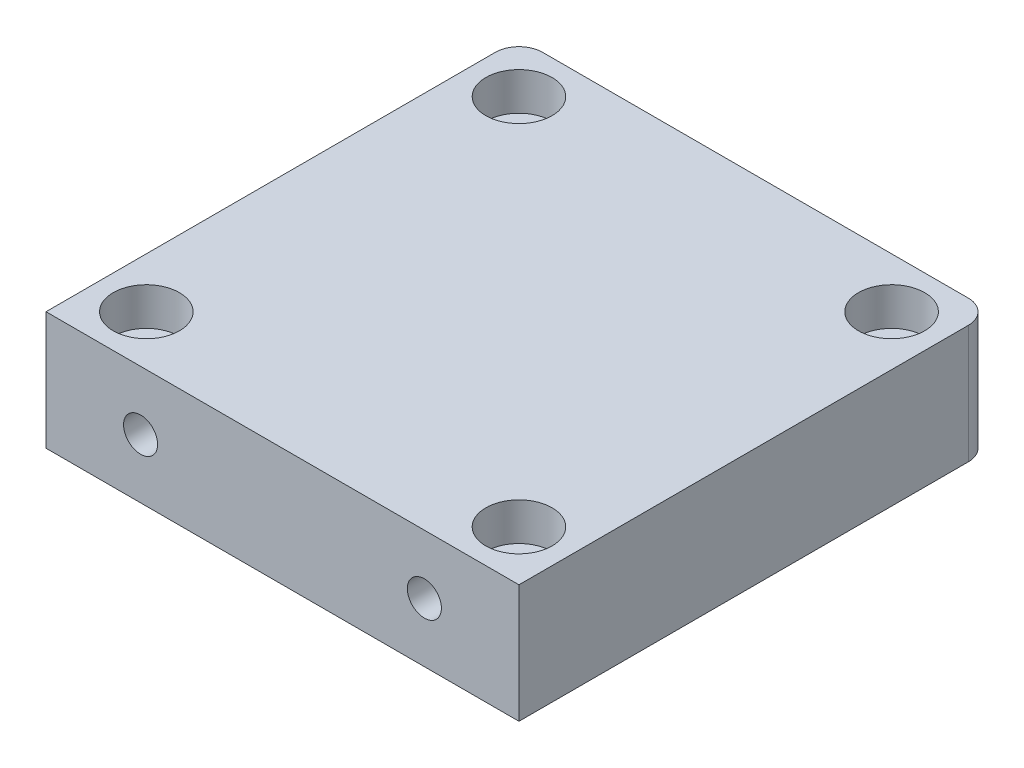
ISO-10303-21;
HEADER;
FILE_DESCRIPTION(('STEP AP214'),'2;1');
FILE_NAME('part.step','',(''),(''),'','','');
FILE_SCHEMA(('AUTOMOTIVE_DESIGN { 1 0 10303 214 1 1 1 1 }'));
ENDSEC;
DATA;
#1=APPLICATION_CONTEXT('core data for automotive mechanical design processes');
#2=APPLICATION_PROTOCOL_DEFINITION('international standard','automotive_design',2000,#1);
#3=PRODUCT_CONTEXT('',#1,'mechanical');
#4=PRODUCT('Part','Part','',(#3));
#5=PRODUCT_RELATED_PRODUCT_CATEGORY('part','',(#4));
#6=PRODUCT_DEFINITION_FORMATION('','',#4);
#7=PRODUCT_DEFINITION_CONTEXT('part definition',#1,'design');
#8=PRODUCT_DEFINITION('design','',#6,#7);
#9=PRODUCT_DEFINITION_SHAPE('','',#8);
#10=(LENGTH_UNIT() NAMED_UNIT(*) SI_UNIT(.MILLI.,.METRE.));
#11=(NAMED_UNIT(*) PLANE_ANGLE_UNIT() SI_UNIT($,.RADIAN.));
#12=(NAMED_UNIT(*) SI_UNIT($,.STERADIAN.) SOLID_ANGLE_UNIT());
#13=UNCERTAINTY_MEASURE_WITH_UNIT(LENGTH_MEASURE(1.E-05),#10,'distance_accuracy_value','');
#14=(GEOMETRIC_REPRESENTATION_CONTEXT(3) GLOBAL_UNCERTAINTY_ASSIGNED_CONTEXT((#13)) GLOBAL_UNIT_ASSIGNED_CONTEXT((#10,
#11,#12)) REPRESENTATION_CONTEXT('',''));
#15=CARTESIAN_POINT('',(0.,0.,0.));
#16=DIRECTION('',(0.,0.,1.));
#17=DIRECTION('',(1.,0.,0.));
#18=AXIS2_PLACEMENT_3D('',#15,#16,#17);
#19=CARTESIAN_POINT('',(89.3933982822018,25.,-10.6066017177982));
#20=DIRECTION('',(0.,-1.,0.));
#21=DIRECTION('',(0.,0.,-1.));
#22=AXIS2_PLACEMENT_3D('',#19,#20,#21);
#23=CYLINDRICAL_SURFACE('',#22,4.00000000000001);
#24=CARTESIAN_POINT('',(89.3933982822018,0.,-10.6066017177982));
#25=DIRECTION('',(0.,1.,0.));
#26=DIRECTION('',(0.,0.,1.));
#27=AXIS2_PLACEMENT_3D('',#24,#25,#26);
#28=CIRCLE('',#27,4.00000000000001);
#29=CARTESIAN_POINT('',(89.3933982822018,0.,-6.60660171779821));
#30=VERTEX_POINT('',#29);
#31=EDGE_CURVE('E140',#30,#30,#28,.T.);
#32=ORIENTED_EDGE('',*,*,#31,.F.);
#33=EDGE_LOOP('',(#32));
#34=FACE_BOUND('',#33,.T.);
#35=CARTESIAN_POINT('',(89.3933982822018,17.,-10.6066017177982));
#36=DIRECTION('',(0.,1.,0.));
#37=DIRECTION('',(0.,0.,1.));
#38=AXIS2_PLACEMENT_3D('',#35,#36,#37);
#39=CIRCLE('',#38,4.00000000000001);
#40=CARTESIAN_POINT('',(89.3933982822018,17.,-6.60660171779821));
#41=VERTEX_POINT('',#40);
#42=EDGE_CURVE('E51',#41,#41,#39,.T.);
#43=ORIENTED_EDGE('',*,*,#42,.T.);
#44=EDGE_LOOP('',(#43));
#45=FACE_BOUND('',#44,.T.);
#46=ADVANCED_FACE('F47',(#34,#45),#23,.F.);
#47=CARTESIAN_POINT('',(89.3933982822018,25.,-89.3933982822018));
#48=DIRECTION('',(0.,-1.,0.));
#49=DIRECTION('',(0.,0.,-1.));
#50=AXIS2_PLACEMENT_3D('',#47,#48,#49);
#51=CYLINDRICAL_SURFACE('',#50,4.00000000000001);
#52=CARTESIAN_POINT('',(89.3933982822018,0.,-89.3933982822018));
#53=DIRECTION('',(0.,1.,0.));
#54=DIRECTION('',(0.,0.,1.));
#55=AXIS2_PLACEMENT_3D('',#52,#53,#54);
#56=CIRCLE('',#55,4.00000000000001);
#57=CARTESIAN_POINT('',(89.3933982822018,0.,-85.3933982822018));
#58=VERTEX_POINT('',#57);
#59=EDGE_CURVE('E136',#58,#58,#56,.T.);
#60=ORIENTED_EDGE('',*,*,#59,.F.);
#61=EDGE_LOOP('',(#60));
#62=FACE_BOUND('',#61,.T.);
#63=CARTESIAN_POINT('',(89.3933982822018,17.,-89.3933982822018));
#64=DIRECTION('',(0.,1.,0.));
#65=DIRECTION('',(0.,0.,1.));
#66=AXIS2_PLACEMENT_3D('',#63,#64,#65);
#67=CIRCLE('',#66,4.00000000000001);
#68=CARTESIAN_POINT('',(89.3933982822018,17.,-85.3933982822018));
#69=VERTEX_POINT('',#68);
#70=EDGE_CURVE('E172',#69,#69,#67,.T.);
#71=ORIENTED_EDGE('',*,*,#70,.T.);
#72=EDGE_LOOP('',(#71));
#73=FACE_BOUND('',#72,.T.);
#74=ADVANCED_FACE('F216',(#62,#73),#51,.F.);
#75=CARTESIAN_POINT('',(10.6066017177982,25.,-89.3933982822018));
#76=DIRECTION('',(0.,-1.,0.));
#77=DIRECTION('',(0.,0.,-1.));
#78=AXIS2_PLACEMENT_3D('',#75,#76,#77);
#79=CYLINDRICAL_SURFACE('',#78,4.);
#80=CARTESIAN_POINT('',(10.6066017177982,0.,-89.3933982822018));
#81=DIRECTION('',(0.,1.,0.));
#82=DIRECTION('',(0.,0.,1.));
#83=AXIS2_PLACEMENT_3D('',#80,#81,#82);
#84=CIRCLE('',#83,4.);
#85=CARTESIAN_POINT('',(10.6066017177982,0.,-85.3933982822018));
#86=VERTEX_POINT('',#85);
#87=EDGE_CURVE('E133',#86,#86,#84,.T.);
#88=ORIENTED_EDGE('',*,*,#87,.F.);
#89=EDGE_LOOP('',(#88));
#90=FACE_BOUND('',#89,.T.);
#91=CARTESIAN_POINT('',(10.6066017177982,17.,-89.3933982822018));
#92=DIRECTION('',(0.,1.,0.));
#93=DIRECTION('',(0.,0.,1.));
#94=AXIS2_PLACEMENT_3D('',#91,#92,#93);
#95=CIRCLE('',#94,4.);
#96=CARTESIAN_POINT('',(10.6066017177982,17.,-85.3933982822018));
#97=VERTEX_POINT('',#96);
#98=EDGE_CURVE('E170',#97,#97,#95,.T.);
#99=ORIENTED_EDGE('',*,*,#98,.T.);
#100=EDGE_LOOP('',(#99));
#101=FACE_BOUND('',#100,.T.);
#102=ADVANCED_FACE('F222',(#90,#101),#79,.F.);
#103=CARTESIAN_POINT('',(10.6066017177982,25.,-10.6066017177982));
#104=DIRECTION('',(0.,-1.,0.));
#105=DIRECTION('',(0.,0.,-1.));
#106=AXIS2_PLACEMENT_3D('',#103,#104,#105);
#107=CYLINDRICAL_SURFACE('',#106,4.);
#108=CARTESIAN_POINT('',(10.6066017177982,0.,-10.6066017177982));
#109=DIRECTION('',(0.,1.,0.));
#110=DIRECTION('',(0.,0.,1.));
#111=AXIS2_PLACEMENT_3D('',#108,#109,#110);
#112=CIRCLE('',#111,4.);
#113=CARTESIAN_POINT('',(10.6066017177982,0.,-6.60660171779821));
#114=VERTEX_POINT('',#113);
#115=EDGE_CURVE('E143',#114,#114,#112,.T.);
#116=ORIENTED_EDGE('',*,*,#115,.F.);
#117=EDGE_LOOP('',(#116));
#118=FACE_BOUND('',#117,.T.);
#119=CARTESIAN_POINT('',(10.6066017177982,17.,-10.6066017177982));
#120=DIRECTION('',(0.,1.,0.));
#121=DIRECTION('',(0.,0.,1.));
#122=AXIS2_PLACEMENT_3D('',#119,#120,#121);
#123=CIRCLE('',#122,4.);
#124=CARTESIAN_POINT('',(10.6066017177982,17.,-6.60660171779821));
#125=VERTEX_POINT('',#124);
#126=EDGE_CURVE('E165',#125,#125,#123,.T.);
#127=ORIENTED_EDGE('',*,*,#126,.T.);
#128=EDGE_LOOP('',(#127));
#129=FACE_BOUND('',#128,.T.);
#130=ADVANCED_FACE('F227',(#118,#129),#107,.F.);
#131=CARTESIAN_POINT('',(0.,25.,-100.));
#132=DIRECTION('',(0.,0.,-1.));
#133=DIRECTION('',(-1.,0.,0.));
#134=AXIS2_PLACEMENT_3D('',#131,#132,#133);
#135=PLANE('',#134);
#136=DIRECTION('',(1.,0.,0.));
#137=VECTOR('',#136,1.);
#138=CARTESIAN_POINT('',(0.,25.,-100.));
#139=LINE('',#138,#137);
#140=CARTESIAN_POINT('',(5.,25.,-100.));
#141=VERTEX_POINT('',#140);
#142=CARTESIAN_POINT('',(95.,25.,-100.));
#143=VERTEX_POINT('',#142);
#144=EDGE_CURVE('E125',#141,#143,#139,.T.);
#145=ORIENTED_EDGE('',*,*,#144,.T.);
#146=DIRECTION('',(0.,-1.,0.));
#147=VECTOR('',#146,1.);
#148=CARTESIAN_POINT('',(95.,0.,-100.));
#149=LINE('',#148,#147);
#150=CARTESIAN_POINT('',(95.,0.,-100.));
#151=VERTEX_POINT('',#150);
#152=EDGE_CURVE('E155',#143,#151,#149,.T.);
#153=ORIENTED_EDGE('',*,*,#152,.T.);
#154=DIRECTION('',(1.,0.,0.));
#155=VECTOR('',#154,1.);
#156=CARTESIAN_POINT('',(0.,0.,-100.));
#157=LINE('',#156,#155);
#158=CARTESIAN_POINT('',(5.,0.,-100.));
#159=VERTEX_POINT('',#158);
#160=EDGE_CURVE('E146',#159,#151,#157,.T.);
#161=ORIENTED_EDGE('',*,*,#160,.F.);
#162=DIRECTION('',(0.,-1.,0.));
#163=VECTOR('',#162,1.);
#164=CARTESIAN_POINT('',(5.,25.,-100.));
#165=LINE('',#164,#163);
#166=EDGE_CURVE('E114',#159,#141,#165,.F.);
#167=ORIENTED_EDGE('',*,*,#166,.T.);
#168=EDGE_LOOP('',(#145,#153,#161,#167));
#169=FACE_BOUND('',#168,.T.);
#170=ADVANCED_FACE('F212',(#169),#135,.T.);
#171=CARTESIAN_POINT('',(0.,25.,0.));
#172=DIRECTION('',(-1.,0.,0.));
#173=DIRECTION('',(0.,0.,1.));
#174=AXIS2_PLACEMENT_3D('',#171,#172,#173);
#175=PLANE('',#174);
#176=DIRECTION('',(0.,0.,-1.));
#177=VECTOR('',#176,1.);
#178=CARTESIAN_POINT('',(0.,25.,0.));
#179=LINE('',#178,#177);
#180=CARTESIAN_POINT('',(0.,25.,0.));
#181=VERTEX_POINT('',#180);
#182=CARTESIAN_POINT('',(0.,25.,-95.));
#183=VERTEX_POINT('',#182);
#184=EDGE_CURVE('E107',#181,#183,#179,.T.);
#185=ORIENTED_EDGE('',*,*,#184,.T.);
#186=DIRECTION('',(0.,-1.,0.));
#187=VECTOR('',#186,1.);
#188=CARTESIAN_POINT('',(0.,25.,-95.));
#189=LINE('',#188,#187);
#190=CARTESIAN_POINT('',(0.,0.,-95.));
#191=VERTEX_POINT('',#190);
#192=EDGE_CURVE('E13',#183,#191,#189,.T.);
#193=ORIENTED_EDGE('',*,*,#192,.T.);
#194=DIRECTION('',(0.,0.,-1.));
#195=VECTOR('',#194,1.);
#196=CARTESIAN_POINT('',(0.,0.,0.));
#197=LINE('',#196,#195);
#198=CARTESIAN_POINT('',(0.,0.,0.));
#199=VERTEX_POINT('',#198);
#200=EDGE_CURVE('E110',#199,#191,#197,.T.);
#201=ORIENTED_EDGE('',*,*,#200,.F.);
#202=DIRECTION('',(0.,-1.,0.));
#203=VECTOR('',#202,1.);
#204=CARTESIAN_POINT('',(0.,25.,0.));
#205=LINE('',#204,#203);
#206=EDGE_CURVE('E104',#181,#199,#205,.T.);
#207=ORIENTED_EDGE('',*,*,#206,.F.);
#208=EDGE_LOOP('',(#185,#193,#201,#207));
#209=FACE_BOUND('',#208,.T.);
#210=ADVANCED_FACE('F106',(#209),#175,.T.);
#211=CARTESIAN_POINT('',(0.,25.,0.));
#212=DIRECTION('',(0.,0.,-1.));
#213=DIRECTION('',(-1.,0.,0.));
#214=AXIS2_PLACEMENT_3D('',#211,#212,#213);
#215=PLANE('',#214);
#216=CARTESIAN_POINT('',(80.,12.5,0.));
#217=DIRECTION('',(0.,0.,1.));
#218=DIRECTION('',(1.,0.,0.));
#219=AXIS2_PLACEMENT_3D('',#216,#217,#218);
#220=CIRCLE('',#219,3.6);
#221=CARTESIAN_POINT('',(83.6,12.5,0.));
#222=VERTEX_POINT('',#221);
#223=EDGE_CURVE('E191',#222,#222,#220,.T.);
#224=ORIENTED_EDGE('',*,*,#223,.F.);
#225=EDGE_LOOP('',(#224));
#226=FACE_BOUND('',#225,.T.);
#227=CARTESIAN_POINT('',(20.,12.5,0.));
#228=DIRECTION('',(0.,0.,1.));
#229=DIRECTION('',(1.,0.,0.));
#230=AXIS2_PLACEMENT_3D('',#227,#228,#229);
#231=CIRCLE('',#230,3.6);
#232=CARTESIAN_POINT('',(23.6,12.5,0.));
#233=VERTEX_POINT('',#232);
#234=EDGE_CURVE('E194',#233,#233,#231,.T.);
#235=ORIENTED_EDGE('',*,*,#234,.F.);
#236=EDGE_LOOP('',(#235));
#237=FACE_BOUND('',#236,.T.);
#238=DIRECTION('',(1.,0.,0.));
#239=VECTOR('',#238,1.);
#240=CARTESIAN_POINT('',(0.,0.,0.));
#241=LINE('',#240,#239);
#242=CARTESIAN_POINT('',(100.,0.,0.));
#243=VERTEX_POINT('',#242);
#244=EDGE_CURVE('E150',#199,#243,#241,.T.);
#245=ORIENTED_EDGE('',*,*,#244,.T.);
#246=DIRECTION('',(0.,-1.,0.));
#247=VECTOR('',#246,1.);
#248=CARTESIAN_POINT('',(100.,25.,0.));
#249=LINE('',#248,#247);
#250=CARTESIAN_POINT('',(100.,25.,0.));
#251=VERTEX_POINT('',#250);
#252=EDGE_CURVE('E115',#251,#243,#249,.T.);
#253=ORIENTED_EDGE('',*,*,#252,.F.);
#254=DIRECTION('',(1.,0.,0.));
#255=VECTOR('',#254,1.);
#256=CARTESIAN_POINT('',(0.,25.,0.));
#257=LINE('',#256,#255);
#258=EDGE_CURVE('E119',#181,#251,#257,.T.);
#259=ORIENTED_EDGE('',*,*,#258,.F.);
#260=ORIENTED_EDGE('',*,*,#206,.T.);
#261=EDGE_LOOP('',(#245,#253,#259,#260));
#262=FACE_BOUND('',#261,.T.);
#263=ADVANCED_FACE('F120',(#226,#237,#262),#215,.F.);
#264=CARTESIAN_POINT('',(100.,25.,0.));
#265=DIRECTION('',(-1.,0.,0.));
#266=DIRECTION('',(0.,0.,1.));
#267=AXIS2_PLACEMENT_3D('',#264,#265,#266);
#268=PLANE('',#267);
#269=DIRECTION('',(0.,0.,-1.));
#270=VECTOR('',#269,1.);
#271=CARTESIAN_POINT('',(100.,0.,0.));
#272=LINE('',#271,#270);
#273=CARTESIAN_POINT('',(100.,0.,-95.));
#274=VERTEX_POINT('',#273);
#275=EDGE_CURVE('E128',#243,#274,#272,.T.);
#276=ORIENTED_EDGE('',*,*,#275,.T.);
#277=DIRECTION('',(0.,-1.,0.));
#278=VECTOR('',#277,1.);
#279=CARTESIAN_POINT('',(100.,25.,-95.));
#280=LINE('',#279,#278);
#281=CARTESIAN_POINT('',(100.,25.,-95.));
#282=VERTEX_POINT('',#281);
#283=EDGE_CURVE('E72',#274,#282,#280,.F.);
#284=ORIENTED_EDGE('',*,*,#283,.T.);
#285=DIRECTION('',(0.,0.,-1.));
#286=VECTOR('',#285,1.);
#287=CARTESIAN_POINT('',(100.,25.,0.));
#288=LINE('',#287,#286);
#289=EDGE_CURVE('E122',#251,#282,#288,.T.);
#290=ORIENTED_EDGE('',*,*,#289,.F.);
#291=ORIENTED_EDGE('',*,*,#252,.T.);
#292=EDGE_LOOP('',(#276,#284,#290,#291));
#293=FACE_BOUND('',#292,.T.);
#294=ADVANCED_FACE('F204',(#293),#268,.F.);
#295=CARTESIAN_POINT('',(0.,25.,0.));
#296=DIRECTION('',(0.,1.,0.));
#297=DIRECTION('',(0.,0.,1.));
#298=AXIS2_PLACEMENT_3D('',#295,#296,#297);
#299=PLANE('',#298);
#300=CARTESIAN_POINT('',(10.6066017177982,25.,-89.3933982822018));
#301=DIRECTION('',(0.,1.,0.));
#302=DIRECTION('',(0.,0.,1.));
#303=AXIS2_PLACEMENT_3D('',#300,#301,#302);
#304=CIRCLE('',#303,7.);
#305=CARTESIAN_POINT('',(10.6066017177982,25.,-96.3933982822018));
#306=VERTEX_POINT('',#305);
#307=EDGE_CURVE('E309',#306,#306,#304,.T.);
#308=ORIENTED_EDGE('',*,*,#307,.F.);
#309=EDGE_LOOP('',(#308));
#310=FACE_BOUND('',#309,.T.);
#311=CARTESIAN_POINT('',(89.3933982822018,25.,-89.3933982822018));
#312=DIRECTION('',(0.,1.,0.));
#313=DIRECTION('',(0.,0.,1.));
#314=AXIS2_PLACEMENT_3D('',#311,#312,#313);
#315=CIRCLE('',#314,7.);
#316=CARTESIAN_POINT('',(89.3933982822018,25.,-96.3933982822018));
#317=VERTEX_POINT('',#316);
#318=EDGE_CURVE('E314',#317,#317,#315,.T.);
#319=ORIENTED_EDGE('',*,*,#318,.F.);
#320=EDGE_LOOP('',(#319));
#321=FACE_BOUND('',#320,.T.);
#322=CARTESIAN_POINT('',(89.3933982822018,25.,-10.6066017177982));
#323=DIRECTION('',(0.,1.,0.));
#324=DIRECTION('',(0.,0.,1.));
#325=AXIS2_PLACEMENT_3D('',#322,#323,#324);
#326=CIRCLE('',#325,7.);
#327=CARTESIAN_POINT('',(89.3933982822018,25.,-17.6066017177982));
#328=VERTEX_POINT('',#327);
#329=EDGE_CURVE('E318',#328,#328,#326,.T.);
#330=ORIENTED_EDGE('',*,*,#329,.F.);
#331=EDGE_LOOP('',(#330));
#332=FACE_BOUND('',#331,.T.);
#333=CARTESIAN_POINT('',(10.6066017177982,25.,-10.6066017177982));
#334=DIRECTION('',(0.,1.,0.));
#335=DIRECTION('',(0.,0.,1.));
#336=AXIS2_PLACEMENT_3D('',#333,#334,#335);
#337=CIRCLE('',#336,7.);
#338=CARTESIAN_POINT('',(10.6066017177982,25.,-17.6066017177982));
#339=VERTEX_POINT('',#338);
#340=EDGE_CURVE('E169',#339,#339,#337,.T.);
#341=ORIENTED_EDGE('',*,*,#340,.F.);
#342=EDGE_LOOP('',(#341));
#343=FACE_BOUND('',#342,.T.);
#344=ORIENTED_EDGE('',*,*,#289,.T.);
#345=CARTESIAN_POINT('',(95.,25.,-95.));
#346=DIRECTION('',(0.,1.,0.));
#347=DIRECTION('',(0.,0.,1.));
#348=AXIS2_PLACEMENT_3D('',#345,#346,#347);
#349=CIRCLE('',#348,5.);
#350=EDGE_CURVE('E56',#282,#143,#349,.T.);
#351=ORIENTED_EDGE('',*,*,#350,.T.);
#352=ORIENTED_EDGE('',*,*,#144,.F.);
#353=CARTESIAN_POINT('',(5.,25.,-95.));
#354=DIRECTION('',(0.,1.,0.));
#355=DIRECTION('',(0.,0.,1.));
#356=AXIS2_PLACEMENT_3D('',#353,#354,#355);
#357=CIRCLE('',#356,5.);
#358=EDGE_CURVE('E64',#141,#183,#357,.T.);
#359=ORIENTED_EDGE('',*,*,#358,.T.);
#360=ORIENTED_EDGE('',*,*,#184,.F.);
#361=ORIENTED_EDGE('',*,*,#258,.T.);
#362=EDGE_LOOP('',(#344,#351,#352,#359,#360,#361));
#363=FACE_BOUND('',#362,.T.);
#364=ADVANCED_FACE('F124',(#310,#321,#332,#343,#363),#299,.T.);
#365=CARTESIAN_POINT('',(0.,0.,0.));
#366=DIRECTION('',(0.,1.,0.));
#367=DIRECTION('',(0.,0.,1.));
#368=AXIS2_PLACEMENT_3D('',#365,#366,#367);
#369=PLANE('',#368);
#370=ORIENTED_EDGE('',*,*,#87,.T.);
#371=EDGE_LOOP('',(#370));
#372=FACE_BOUND('',#371,.T.);
#373=ORIENTED_EDGE('',*,*,#59,.T.);
#374=EDGE_LOOP('',(#373));
#375=FACE_BOUND('',#374,.T.);
#376=ORIENTED_EDGE('',*,*,#31,.T.);
#377=EDGE_LOOP('',(#376));
#378=FACE_BOUND('',#377,.T.);
#379=ORIENTED_EDGE('',*,*,#115,.T.);
#380=EDGE_LOOP('',(#379));
#381=FACE_BOUND('',#380,.T.);
#382=ORIENTED_EDGE('',*,*,#160,.T.);
#383=CARTESIAN_POINT('',(95.,0.,-95.));
#384=DIRECTION('',(0.,1.,0.));
#385=DIRECTION('',(0.,0.,1.));
#386=AXIS2_PLACEMENT_3D('',#383,#384,#385);
#387=CIRCLE('',#386,5.);
#388=EDGE_CURVE('E160',#151,#274,#387,.F.);
#389=ORIENTED_EDGE('',*,*,#388,.T.);
#390=ORIENTED_EDGE('',*,*,#275,.F.);
#391=ORIENTED_EDGE('',*,*,#244,.F.);
#392=ORIENTED_EDGE('',*,*,#200,.T.);
#393=CARTESIAN_POINT('',(5.,0.,-95.));
#394=DIRECTION('',(0.,1.,0.));
#395=DIRECTION('',(0.,0.,1.));
#396=AXIS2_PLACEMENT_3D('',#393,#394,#395);
#397=CIRCLE('',#396,5.);
#398=EDGE_CURVE('E158',#191,#159,#397,.F.);
#399=ORIENTED_EDGE('',*,*,#398,.T.);
#400=EDGE_LOOP('',(#382,#389,#390,#391,#392,#399));
#401=FACE_BOUND('',#400,.T.);
#402=ADVANCED_FACE('F251',(#372,#375,#378,#381,#401),#369,.F.);
#403=CARTESIAN_POINT('',(20.,12.5,-20.));
#404=DIRECTION('',(0.,0.,1.));
#405=DIRECTION('',(1.,0.,0.));
#406=AXIS2_PLACEMENT_3D('',#403,#404,#405);
#407=CYLINDRICAL_SURFACE('',#406,3.6);
#408=CARTESIAN_POINT('',(20.,12.5,-20.));
#409=DIRECTION('',(0.,0.,1.));
#410=DIRECTION('',(1.,0.,0.));
#411=AXIS2_PLACEMENT_3D('',#408,#409,#410);
#412=CIRCLE('',#411,3.6);
#413=CARTESIAN_POINT('',(23.6,12.5,-20.));
#414=VERTEX_POINT('',#413);
#415=EDGE_CURVE('E137',#414,#414,#412,.T.);
#416=ORIENTED_EDGE('',*,*,#415,.F.);
#417=EDGE_LOOP('',(#416));
#418=FACE_BOUND('',#417,.T.);
#419=ORIENTED_EDGE('',*,*,#234,.T.);
#420=EDGE_LOOP('',(#419));
#421=FACE_BOUND('',#420,.T.);
#422=ADVANCED_FACE('F201',(#418,#421),#407,.F.);
#423=CARTESIAN_POINT('',(20.,12.5,-20.));
#424=DIRECTION('',(0.,0.,1.));
#425=DIRECTION('',(1.,0.,0.));
#426=AXIS2_PLACEMENT_3D('',#423,#424,#425);
#427=PLANE('',#426);
#428=ORIENTED_EDGE('',*,*,#415,.T.);
#429=EDGE_LOOP('',(#428));
#430=FACE_BOUND('',#429,.T.);
#431=ADVANCED_FACE('F259',(#430),#427,.T.);
#432=CARTESIAN_POINT('',(80.,12.5,-20.));
#433=DIRECTION('',(0.,0.,1.));
#434=DIRECTION('',(1.,0.,0.));
#435=AXIS2_PLACEMENT_3D('',#432,#433,#434);
#436=CYLINDRICAL_SURFACE('',#435,3.6);
#437=CARTESIAN_POINT('',(80.,12.5,-20.));
#438=DIRECTION('',(0.,0.,1.));
#439=DIRECTION('',(1.,0.,0.));
#440=AXIS2_PLACEMENT_3D('',#437,#438,#439);
#441=CIRCLE('',#440,3.6);
#442=CARTESIAN_POINT('',(83.6,12.5,-20.));
#443=VERTEX_POINT('',#442);
#444=EDGE_CURVE('E168',#443,#443,#441,.T.);
#445=ORIENTED_EDGE('',*,*,#444,.F.);
#446=EDGE_LOOP('',(#445));
#447=FACE_BOUND('',#446,.T.);
#448=ORIENTED_EDGE('',*,*,#223,.T.);
#449=EDGE_LOOP('',(#448));
#450=FACE_BOUND('',#449,.T.);
#451=ADVANCED_FACE('F242',(#447,#450),#436,.F.);
#452=CARTESIAN_POINT('',(80.,12.5,-20.));
#453=DIRECTION('',(0.,0.,1.));
#454=DIRECTION('',(1.,0.,0.));
#455=AXIS2_PLACEMENT_3D('',#452,#453,#454);
#456=PLANE('',#455);
#457=ORIENTED_EDGE('',*,*,#444,.T.);
#458=EDGE_LOOP('',(#457));
#459=FACE_BOUND('',#458,.T.);
#460=ADVANCED_FACE('F234',(#459),#456,.T.);
#461=CARTESIAN_POINT('',(95.,25.,-95.));
#462=DIRECTION('',(0.,1.,0.));
#463=DIRECTION('',(0.,0.,1.));
#464=AXIS2_PLACEMENT_3D('',#461,#462,#463);
#465=CYLINDRICAL_SURFACE('',#464,5.);
#466=ORIENTED_EDGE('',*,*,#350,.F.);
#467=ORIENTED_EDGE('',*,*,#283,.F.);
#468=ORIENTED_EDGE('',*,*,#388,.F.);
#469=ORIENTED_EDGE('',*,*,#152,.F.);
#470=EDGE_LOOP('',(#466,#467,#468,#469));
#471=FACE_BOUND('',#470,.T.);
#472=ADVANCED_FACE('F232',(#471),#465,.T.);
#473=CARTESIAN_POINT('',(5.,25.,-95.));
#474=DIRECTION('',(0.,-1.,0.));
#475=DIRECTION('',(0.,0.,-1.));
#476=AXIS2_PLACEMENT_3D('',#473,#474,#475);
#477=CYLINDRICAL_SURFACE('',#476,5.);
#478=ORIENTED_EDGE('',*,*,#358,.F.);
#479=ORIENTED_EDGE('',*,*,#166,.F.);
#480=ORIENTED_EDGE('',*,*,#398,.F.);
#481=ORIENTED_EDGE('',*,*,#192,.F.);
#482=EDGE_LOOP('',(#478,#479,#480,#481));
#483=FACE_BOUND('',#482,.T.);
#484=ADVANCED_FACE('F49',(#483),#477,.T.);
#485=CARTESIAN_POINT('',(10.6066017177982,44.7989898732233,-10.6066017177982));
#486=DIRECTION('',(0.,-1.,0.));
#487=DIRECTION('',(0.,0.,-1.));
#488=AXIS2_PLACEMENT_3D('',#485,#486,#487);
#489=CYLINDRICAL_SURFACE('',#488,7.);
#490=CARTESIAN_POINT('',(10.6066017177982,17.,-10.6066017177982));
#491=DIRECTION('',(0.,1.,0.));
#492=DIRECTION('',(0.,0.,1.));
#493=AXIS2_PLACEMENT_3D('',#490,#491,#492);
#494=CIRCLE('',#493,7.);
#495=CARTESIAN_POINT('',(10.6066017177982,17.,-17.6066017177982));
#496=VERTEX_POINT('',#495);
#497=EDGE_CURVE('E178',#496,#496,#494,.T.);
#498=CARTESIAN_POINT('',(10.6066017177982,17.,-17.6066017177982));
#499=CARTESIAN_POINT('',(10.6066017177982,17.0833333333333,-17.6066017177982));
#500=CARTESIAN_POINT('',(10.6066017177982,17.1666666666667,-17.6066017177982));
#501=CARTESIAN_POINT('',(10.6066017177982,17.3333333333333,-17.6066017177982));
#502=CARTESIAN_POINT('',(10.6066017177982,17.4166666666667,-17.6066017177982));
#503=CARTESIAN_POINT('',(10.6066017177982,17.5833333333333,-17.6066017177982));
#504=CARTESIAN_POINT('',(10.6066017177982,17.6666666666667,-17.6066017177982));
#505=CARTESIAN_POINT('',(10.6066017177982,17.8333333333333,-17.6066017177982));
#506=CARTESIAN_POINT('',(10.6066017177982,17.9166666666667,-17.6066017177982));
#507=CARTESIAN_POINT('',(10.6066017177982,18.0833333333333,-17.6066017177982));
#508=CARTESIAN_POINT('',(10.6066017177982,18.1666666666667,-17.6066017177982));
#509=CARTESIAN_POINT('',(10.6066017177982,18.3333333333333,-17.6066017177982));
#510=CARTESIAN_POINT('',(10.6066017177982,18.4166666666667,-17.6066017177982));
#511=CARTESIAN_POINT('',(10.6066017177982,18.5833333333333,-17.6066017177982));
#512=CARTESIAN_POINT('',(10.6066017177982,18.6666666666667,-17.6066017177982));
#513=CARTESIAN_POINT('',(10.6066017177982,18.8333333333333,-17.6066017177982));
#514=CARTESIAN_POINT('',(10.6066017177982,18.9166666666667,-17.6066017177982));
#515=CARTESIAN_POINT('',(10.6066017177982,19.0833333333333,-17.6066017177982));
#516=CARTESIAN_POINT('',(10.6066017177982,19.1666666666667,-17.6066017177982));
#517=CARTESIAN_POINT('',(10.6066017177982,19.3333333333333,-17.6066017177982));
#518=CARTESIAN_POINT('',(10.6066017177982,19.4166666666667,-17.6066017177982));
#519=CARTESIAN_POINT('',(10.6066017177982,19.5833333333333,-17.6066017177982));
#520=CARTESIAN_POINT('',(10.6066017177982,19.6666666666667,-17.6066017177982));
#521=CARTESIAN_POINT('',(10.6066017177982,19.8333333333333,-17.6066017177982));
#522=CARTESIAN_POINT('',(10.6066017177982,19.9166666666667,-17.6066017177982));
#523=CARTESIAN_POINT('',(10.6066017177982,20.0833333333333,-17.6066017177982));
#524=CARTESIAN_POINT('',(10.6066017177982,20.1666666666667,-17.6066017177982));
#525=CARTESIAN_POINT('',(10.6066017177982,20.3333333333333,-17.6066017177982));
#526=CARTESIAN_POINT('',(10.6066017177982,20.4166666666667,-17.6066017177982));
#527=CARTESIAN_POINT('',(10.6066017177982,20.5833333333333,-17.6066017177982));
#528=CARTESIAN_POINT('',(10.6066017177982,20.6666666666667,-17.6066017177982));
#529=CARTESIAN_POINT('',(10.6066017177982,20.8333333333333,-17.6066017177982));
#530=CARTESIAN_POINT('',(10.6066017177982,20.9166666666667,-17.6066017177982));
#531=CARTESIAN_POINT('',(10.6066017177982,21.0833333333333,-17.6066017177982));
#532=CARTESIAN_POINT('',(10.6066017177982,21.1666666666667,-17.6066017177982));
#533=CARTESIAN_POINT('',(10.6066017177982,21.3333333333333,-17.6066017177982));
#534=CARTESIAN_POINT('',(10.6066017177982,21.4166666666667,-17.6066017177982));
#535=CARTESIAN_POINT('',(10.6066017177982,21.5833333333333,-17.6066017177982));
#536=CARTESIAN_POINT('',(10.6066017177982,21.6666666666667,-17.6066017177982));
#537=CARTESIAN_POINT('',(10.6066017177982,21.8333333333333,-17.6066017177982));
#538=CARTESIAN_POINT('',(10.6066017177982,21.9166666666667,-17.6066017177982));
#539=CARTESIAN_POINT('',(10.6066017177982,22.0833333333333,-17.6066017177982));
#540=CARTESIAN_POINT('',(10.6066017177982,22.1666666666667,-17.6066017177982));
#541=CARTESIAN_POINT('',(10.6066017177982,22.3333333333333,-17.6066017177982));
#542=CARTESIAN_POINT('',(10.6066017177982,22.4166666666667,-17.6066017177982));
#543=CARTESIAN_POINT('',(10.6066017177982,22.5833333333333,-17.6066017177982));
#544=CARTESIAN_POINT('',(10.6066017177982,22.6666666666667,-17.6066017177982));
#545=CARTESIAN_POINT('',(10.6066017177982,22.8333333333333,-17.6066017177982));
#546=CARTESIAN_POINT('',(10.6066017177982,22.9166666666667,-17.6066017177982));
#547=CARTESIAN_POINT('',(10.6066017177982,23.0833333333333,-17.6066017177982));
#548=CARTESIAN_POINT('',(10.6066017177982,23.1666666666667,-17.6066017177982));
#549=CARTESIAN_POINT('',(10.6066017177982,23.3333333333333,-17.6066017177982));
#550=CARTESIAN_POINT('',(10.6066017177982,23.4166666666667,-17.6066017177982));
#551=CARTESIAN_POINT('',(10.6066017177982,23.5833333333333,-17.6066017177982));
#552=CARTESIAN_POINT('',(10.6066017177982,23.6666666666667,-17.6066017177982));
#553=CARTESIAN_POINT('',(10.6066017177982,23.8333333333333,-17.6066017177982));
#554=CARTESIAN_POINT('',(10.6066017177982,23.9166666666667,-17.6066017177982));
#555=CARTESIAN_POINT('',(10.6066017177982,24.0833333333333,-17.6066017177982));
#556=CARTESIAN_POINT('',(10.6066017177982,24.1666666666667,-17.6066017177982));
#557=CARTESIAN_POINT('',(10.6066017177982,24.3333333333333,-17.6066017177982));
#558=CARTESIAN_POINT('',(10.6066017177982,24.4166666666667,-17.6066017177982));
#559=CARTESIAN_POINT('',(10.6066017177982,24.5833333333333,-17.6066017177982));
#560=CARTESIAN_POINT('',(10.6066017177982,24.6666666666667,-17.6066017177982));
#561=CARTESIAN_POINT('',(10.6066017177982,24.8333333333333,-17.6066017177982));
#562=CARTESIAN_POINT('',(10.6066017177982,24.9166666666667,-17.6066017177982));
#563=CARTESIAN_POINT('',(10.6066017177982,25.,-17.6066017177982));
#564=B_SPLINE_CURVE_WITH_KNOTS('',3,(#498,#499,#500,#501,#502,#503,#504,#505,#506,#507,#508,
#509,#510,#511,#512,#513,#514,#515,#516,#517,#518,#519,#520,#521,#522,#523,#524,#525,#526,#527,
#528,#529,#530,#531,#532,#533,#534,#535,#536,#537,#538,#539,#540,#541,#542,#543,#544,#545,#546,
#547,#548,#549,#550,#551,#552,#553,#554,#555,#556,#557,#558,#559,#560,#561,#562,#563),
.UNSPECIFIED.,.F.,.F.,(4,2,2,2,2,2,2,2,2,2,2,2,2,2,2,2,2,2,2,2,2,2,2,2,2,2,2,2,2,2,2,2,4),(0.,
0.25,0.5,0.750000000000001,1.,1.25,1.5,1.75,2.,2.25,2.5,2.75,3.,3.25,3.5,3.75,4.,4.25,4.5,4.75,
5.,5.25,5.5,5.75,6.,6.25,6.5,6.75,7.,7.25,7.5,7.75,8.),.UNSPECIFIED.);
#565=EDGE_CURVE('BSEAM240',#496,#339,#564,.T.);
#566=ORIENTED_EDGE('',*,*,#497,.F.);
#567=ORIENTED_EDGE('',*,*,#340,.T.);
#568=ORIENTED_EDGE('',*,*,#565,.T.);
#569=ORIENTED_EDGE('',*,*,#565,.F.);
#570=EDGE_LOOP('',(#566,#568,#567,#569));
#571=FACE_BOUND('',#570,.T.);
#572=ADVANCED_FACE('F240',(#571),#489,.F.);
#573=CARTESIAN_POINT('',(10.6066017177982,17.,-10.6066017177982));
#574=DIRECTION('',(0.,1.,0.));
#575=DIRECTION('',(0.,0.,1.));
#576=AXIS2_PLACEMENT_3D('',#573,#574,#575);
#577=PLANE('',#576);
#578=ORIENTED_EDGE('',*,*,#126,.F.);
#579=EDGE_LOOP('',(#578));
#580=FACE_BOUND('',#579,.T.);
#581=ORIENTED_EDGE('',*,*,#497,.T.);
#582=EDGE_LOOP('',(#581));
#583=FACE_BOUND('',#582,.T.);
#584=ADVANCED_FACE('F274',(#580,#583),#577,.T.);
#585=CARTESIAN_POINT('',(89.3933982822018,44.7989898732233,-10.6066017177982));
#586=DIRECTION('',(0.,-1.,0.));
#587=DIRECTION('',(0.,0.,-1.));
#588=AXIS2_PLACEMENT_3D('',#585,#586,#587);
#589=CYLINDRICAL_SURFACE('',#588,7.);
#590=CARTESIAN_POINT('',(89.3933982822018,17.,-10.6066017177982));
#591=DIRECTION('',(0.,1.,0.));
#592=DIRECTION('',(0.,0.,1.));
#593=AXIS2_PLACEMENT_3D('',#590,#591,#592);
#594=CIRCLE('',#593,7.);
#595=CARTESIAN_POINT('',(89.3933982822018,17.,-17.6066017177982));
#596=VERTEX_POINT('',#595);
#597=EDGE_CURVE('E188',#596,#596,#594,.T.);
#598=CARTESIAN_POINT('',(89.3933982822018,17.,-17.6066017177982));
#599=CARTESIAN_POINT('',(89.3933982822018,17.0833333333333,-17.6066017177982));
#600=CARTESIAN_POINT('',(89.3933982822018,17.1666666666667,-17.6066017177982));
#601=CARTESIAN_POINT('',(89.3933982822018,17.3333333333333,-17.6066017177982));
#602=CARTESIAN_POINT('',(89.3933982822018,17.4166666666667,-17.6066017177982));
#603=CARTESIAN_POINT('',(89.3933982822018,17.5833333333333,-17.6066017177982));
#604=CARTESIAN_POINT('',(89.3933982822018,17.6666666666667,-17.6066017177982));
#605=CARTESIAN_POINT('',(89.3933982822018,17.8333333333333,-17.6066017177982));
#606=CARTESIAN_POINT('',(89.3933982822018,17.9166666666667,-17.6066017177982));
#607=CARTESIAN_POINT('',(89.3933982822018,18.0833333333333,-17.6066017177982));
#608=CARTESIAN_POINT('',(89.3933982822018,18.1666666666667,-17.6066017177982));
#609=CARTESIAN_POINT('',(89.3933982822018,18.3333333333333,-17.6066017177982));
#610=CARTESIAN_POINT('',(89.3933982822018,18.4166666666667,-17.6066017177982));
#611=CARTESIAN_POINT('',(89.3933982822018,18.5833333333333,-17.6066017177982));
#612=CARTESIAN_POINT('',(89.3933982822018,18.6666666666667,-17.6066017177982));
#613=CARTESIAN_POINT('',(89.3933982822018,18.8333333333333,-17.6066017177982));
#614=CARTESIAN_POINT('',(89.3933982822018,18.9166666666667,-17.6066017177982));
#615=CARTESIAN_POINT('',(89.3933982822018,19.0833333333333,-17.6066017177982));
#616=CARTESIAN_POINT('',(89.3933982822018,19.1666666666667,-17.6066017177982));
#617=CARTESIAN_POINT('',(89.3933982822018,19.3333333333333,-17.6066017177982));
#618=CARTESIAN_POINT('',(89.3933982822018,19.4166666666667,-17.6066017177982));
#619=CARTESIAN_POINT('',(89.3933982822018,19.5833333333333,-17.6066017177982));
#620=CARTESIAN_POINT('',(89.3933982822018,19.6666666666667,-17.6066017177982));
#621=CARTESIAN_POINT('',(89.3933982822018,19.8333333333333,-17.6066017177982));
#622=CARTESIAN_POINT('',(89.3933982822018,19.9166666666667,-17.6066017177982));
#623=CARTESIAN_POINT('',(89.3933982822018,20.0833333333333,-17.6066017177982));
#624=CARTESIAN_POINT('',(89.3933982822018,20.1666666666667,-17.6066017177982));
#625=CARTESIAN_POINT('',(89.3933982822018,20.3333333333333,-17.6066017177982));
#626=CARTESIAN_POINT('',(89.3933982822018,20.4166666666667,-17.6066017177982));
#627=CARTESIAN_POINT('',(89.3933982822018,20.5833333333333,-17.6066017177982));
#628=CARTESIAN_POINT('',(89.3933982822018,20.6666666666667,-17.6066017177982));
#629=CARTESIAN_POINT('',(89.3933982822018,20.8333333333333,-17.6066017177982));
#630=CARTESIAN_POINT('',(89.3933982822018,20.9166666666667,-17.6066017177982));
#631=CARTESIAN_POINT('',(89.3933982822018,21.0833333333333,-17.6066017177982));
#632=CARTESIAN_POINT('',(89.3933982822018,21.1666666666667,-17.6066017177982));
#633=CARTESIAN_POINT('',(89.3933982822018,21.3333333333333,-17.6066017177982));
#634=CARTESIAN_POINT('',(89.3933982822018,21.4166666666667,-17.6066017177982));
#635=CARTESIAN_POINT('',(89.3933982822018,21.5833333333333,-17.6066017177982));
#636=CARTESIAN_POINT('',(89.3933982822018,21.6666666666667,-17.6066017177982));
#637=CARTESIAN_POINT('',(89.3933982822018,21.8333333333333,-17.6066017177982));
#638=CARTESIAN_POINT('',(89.3933982822018,21.9166666666667,-17.6066017177982));
#639=CARTESIAN_POINT('',(89.3933982822018,22.0833333333333,-17.6066017177982));
#640=CARTESIAN_POINT('',(89.3933982822018,22.1666666666667,-17.6066017177982));
#641=CARTESIAN_POINT('',(89.3933982822018,22.3333333333333,-17.6066017177982));
#642=CARTESIAN_POINT('',(89.3933982822018,22.4166666666667,-17.6066017177982));
#643=CARTESIAN_POINT('',(89.3933982822018,22.5833333333333,-17.6066017177982));
#644=CARTESIAN_POINT('',(89.3933982822018,22.6666666666667,-17.6066017177982));
#645=CARTESIAN_POINT('',(89.3933982822018,22.8333333333333,-17.6066017177982));
#646=CARTESIAN_POINT('',(89.3933982822018,22.9166666666667,-17.6066017177982));
#647=CARTESIAN_POINT('',(89.3933982822018,23.0833333333333,-17.6066017177982));
#648=CARTESIAN_POINT('',(89.3933982822018,23.1666666666667,-17.6066017177982));
#649=CARTESIAN_POINT('',(89.3933982822018,23.3333333333333,-17.6066017177982));
#650=CARTESIAN_POINT('',(89.3933982822018,23.4166666666667,-17.6066017177982));
#651=CARTESIAN_POINT('',(89.3933982822018,23.5833333333333,-17.6066017177982));
#652=CARTESIAN_POINT('',(89.3933982822018,23.6666666666667,-17.6066017177982));
#653=CARTESIAN_POINT('',(89.3933982822018,23.8333333333333,-17.6066017177982));
#654=CARTESIAN_POINT('',(89.3933982822018,23.9166666666667,-17.6066017177982));
#655=CARTESIAN_POINT('',(89.3933982822018,24.0833333333333,-17.6066017177982));
#656=CARTESIAN_POINT('',(89.3933982822018,24.1666666666667,-17.6066017177982));
#657=CARTESIAN_POINT('',(89.3933982822018,24.3333333333333,-17.6066017177982));
#658=CARTESIAN_POINT('',(89.3933982822018,24.4166666666667,-17.6066017177982));
#659=CARTESIAN_POINT('',(89.3933982822018,24.5833333333333,-17.6066017177982));
#660=CARTESIAN_POINT('',(89.3933982822018,24.6666666666667,-17.6066017177982));
#661=CARTESIAN_POINT('',(89.3933982822018,24.8333333333333,-17.6066017177982));
#662=CARTESIAN_POINT('',(89.3933982822018,24.9166666666667,-17.6066017177982));
#663=CARTESIAN_POINT('',(89.3933982822018,25.,-17.6066017177982));
#664=B_SPLINE_CURVE_WITH_KNOTS('',3,(#598,#599,#600,#601,#602,#603,#604,#605,#606,#607,#608,
#609,#610,#611,#612,#613,#614,#615,#616,#617,#618,#619,#620,#621,#622,#623,#624,#625,#626,#627,
#628,#629,#630,#631,#632,#633,#634,#635,#636,#637,#638,#639,#640,#641,#642,#643,#644,#645,#646,
#647,#648,#649,#650,#651,#652,#653,#654,#655,#656,#657,#658,#659,#660,#661,#662,#663),
.UNSPECIFIED.,.F.,.F.,(4,2,2,2,2,2,2,2,2,2,2,2,2,2,2,2,2,2,2,2,2,2,2,2,2,2,2,2,2,2,2,2,4),(0.,
0.25,0.5,0.750000000000001,1.,1.25,1.5,1.75,2.,2.25,2.5,2.75,3.,3.25,3.5,3.75,4.,4.25,4.5,4.75,
5.,5.25,5.5,5.75,6.,6.25,6.5,6.75,7.,7.25,7.5,7.75,8.),.UNSPECIFIED.);
#665=EDGE_CURVE('BSEAM278',#596,#328,#664,.T.);
#666=ORIENTED_EDGE('',*,*,#597,.F.);
#667=ORIENTED_EDGE('',*,*,#329,.T.);
#668=ORIENTED_EDGE('',*,*,#665,.T.);
#669=ORIENTED_EDGE('',*,*,#665,.F.);
#670=EDGE_LOOP('',(#666,#668,#667,#669));
#671=FACE_BOUND('',#670,.T.);
#672=ADVANCED_FACE('F278',(#671),#589,.F.);
#673=CARTESIAN_POINT('',(89.3933982822018,17.,-10.6066017177982));
#674=DIRECTION('',(0.,1.,0.));
#675=DIRECTION('',(0.,0.,1.));
#676=AXIS2_PLACEMENT_3D('',#673,#674,#675);
#677=PLANE('',#676);
#678=ORIENTED_EDGE('',*,*,#42,.F.);
#679=EDGE_LOOP('',(#678));
#680=FACE_BOUND('',#679,.T.);
#681=ORIENTED_EDGE('',*,*,#597,.T.);
#682=EDGE_LOOP('',(#681));
#683=FACE_BOUND('',#682,.T.);
#684=ADVANCED_FACE('F280',(#680,#683),#677,.T.);
#685=CARTESIAN_POINT('',(89.3933982822018,44.7989898732233,-89.3933982822018));
#686=DIRECTION('',(0.,-1.,0.));
#687=DIRECTION('',(0.,0.,-1.));
#688=AXIS2_PLACEMENT_3D('',#685,#686,#687);
#689=CYLINDRICAL_SURFACE('',#688,7.);
#690=CARTESIAN_POINT('',(89.3933982822018,17.,-89.3933982822018));
#691=DIRECTION('',(0.,1.,0.));
#692=DIRECTION('',(0.,0.,1.));
#693=AXIS2_PLACEMENT_3D('',#690,#691,#692);
#694=CIRCLE('',#693,7.);
#695=CARTESIAN_POINT('',(89.3933982822018,17.,-96.3933982822018));
#696=VERTEX_POINT('',#695);
#697=EDGE_CURVE('E310',#696,#696,#694,.T.);
#698=CARTESIAN_POINT('',(89.3933982822018,17.,-96.3933982822018));
#699=CARTESIAN_POINT('',(89.3933982822018,17.0833333333333,-96.3933982822018));
#700=CARTESIAN_POINT('',(89.3933982822018,17.1666666666667,-96.3933982822018));
#701=CARTESIAN_POINT('',(89.3933982822018,17.3333333333333,-96.3933982822018));
#702=CARTESIAN_POINT('',(89.3933982822018,17.4166666666667,-96.3933982822018));
#703=CARTESIAN_POINT('',(89.3933982822018,17.5833333333333,-96.3933982822018));
#704=CARTESIAN_POINT('',(89.3933982822018,17.6666666666667,-96.3933982822018));
#705=CARTESIAN_POINT('',(89.3933982822018,17.8333333333333,-96.3933982822018));
#706=CARTESIAN_POINT('',(89.3933982822018,17.9166666666667,-96.3933982822018));
#707=CARTESIAN_POINT('',(89.3933982822018,18.0833333333333,-96.3933982822018));
#708=CARTESIAN_POINT('',(89.3933982822018,18.1666666666667,-96.3933982822018));
#709=CARTESIAN_POINT('',(89.3933982822018,18.3333333333333,-96.3933982822018));
#710=CARTESIAN_POINT('',(89.3933982822018,18.4166666666667,-96.3933982822018));
#711=CARTESIAN_POINT('',(89.3933982822018,18.5833333333333,-96.3933982822018));
#712=CARTESIAN_POINT('',(89.3933982822018,18.6666666666667,-96.3933982822018));
#713=CARTESIAN_POINT('',(89.3933982822018,18.8333333333333,-96.3933982822018));
#714=CARTESIAN_POINT('',(89.3933982822018,18.9166666666667,-96.3933982822018));
#715=CARTESIAN_POINT('',(89.3933982822018,19.0833333333333,-96.3933982822018));
#716=CARTESIAN_POINT('',(89.3933982822018,19.1666666666667,-96.3933982822018));
#717=CARTESIAN_POINT('',(89.3933982822018,19.3333333333333,-96.3933982822018));
#718=CARTESIAN_POINT('',(89.3933982822018,19.4166666666667,-96.3933982822018));
#719=CARTESIAN_POINT('',(89.3933982822018,19.5833333333333,-96.3933982822018));
#720=CARTESIAN_POINT('',(89.3933982822018,19.6666666666667,-96.3933982822018));
#721=CARTESIAN_POINT('',(89.3933982822018,19.8333333333333,-96.3933982822018));
#722=CARTESIAN_POINT('',(89.3933982822018,19.9166666666667,-96.3933982822018));
#723=CARTESIAN_POINT('',(89.3933982822018,20.0833333333333,-96.3933982822018));
#724=CARTESIAN_POINT('',(89.3933982822018,20.1666666666667,-96.3933982822018));
#725=CARTESIAN_POINT('',(89.3933982822018,20.3333333333333,-96.3933982822018));
#726=CARTESIAN_POINT('',(89.3933982822018,20.4166666666667,-96.3933982822018));
#727=CARTESIAN_POINT('',(89.3933982822018,20.5833333333333,-96.3933982822018));
#728=CARTESIAN_POINT('',(89.3933982822018,20.6666666666667,-96.3933982822018));
#729=CARTESIAN_POINT('',(89.3933982822018,20.8333333333333,-96.3933982822018));
#730=CARTESIAN_POINT('',(89.3933982822018,20.9166666666667,-96.3933982822018));
#731=CARTESIAN_POINT('',(89.3933982822018,21.0833333333333,-96.3933982822018));
#732=CARTESIAN_POINT('',(89.3933982822018,21.1666666666667,-96.3933982822018));
#733=CARTESIAN_POINT('',(89.3933982822018,21.3333333333333,-96.3933982822018));
#734=CARTESIAN_POINT('',(89.3933982822018,21.4166666666667,-96.3933982822018));
#735=CARTESIAN_POINT('',(89.3933982822018,21.5833333333333,-96.3933982822018));
#736=CARTESIAN_POINT('',(89.3933982822018,21.6666666666667,-96.3933982822018));
#737=CARTESIAN_POINT('',(89.3933982822018,21.8333333333333,-96.3933982822018));
#738=CARTESIAN_POINT('',(89.3933982822018,21.9166666666667,-96.3933982822018));
#739=CARTESIAN_POINT('',(89.3933982822018,22.0833333333333,-96.3933982822018));
#740=CARTESIAN_POINT('',(89.3933982822018,22.1666666666667,-96.3933982822018));
#741=CARTESIAN_POINT('',(89.3933982822018,22.3333333333333,-96.3933982822018));
#742=CARTESIAN_POINT('',(89.3933982822018,22.4166666666667,-96.3933982822018));
#743=CARTESIAN_POINT('',(89.3933982822018,22.5833333333333,-96.3933982822018));
#744=CARTESIAN_POINT('',(89.3933982822018,22.6666666666667,-96.3933982822018));
#745=CARTESIAN_POINT('',(89.3933982822018,22.8333333333333,-96.3933982822018));
#746=CARTESIAN_POINT('',(89.3933982822018,22.9166666666667,-96.3933982822018));
#747=CARTESIAN_POINT('',(89.3933982822018,23.0833333333333,-96.3933982822018));
#748=CARTESIAN_POINT('',(89.3933982822018,23.1666666666667,-96.3933982822018));
#749=CARTESIAN_POINT('',(89.3933982822018,23.3333333333333,-96.3933982822018));
#750=CARTESIAN_POINT('',(89.3933982822018,23.4166666666667,-96.3933982822018));
#751=CARTESIAN_POINT('',(89.3933982822018,23.5833333333333,-96.3933982822018));
#752=CARTESIAN_POINT('',(89.3933982822018,23.6666666666667,-96.3933982822018));
#753=CARTESIAN_POINT('',(89.3933982822018,23.8333333333333,-96.3933982822018));
#754=CARTESIAN_POINT('',(89.3933982822018,23.9166666666667,-96.3933982822018));
#755=CARTESIAN_POINT('',(89.3933982822018,24.0833333333333,-96.3933982822018));
#756=CARTESIAN_POINT('',(89.3933982822018,24.1666666666667,-96.3933982822018));
#757=CARTESIAN_POINT('',(89.3933982822018,24.3333333333333,-96.3933982822018));
#758=CARTESIAN_POINT('',(89.3933982822018,24.4166666666667,-96.3933982822018));
#759=CARTESIAN_POINT('',(89.3933982822018,24.5833333333333,-96.3933982822018));
#760=CARTESIAN_POINT('',(89.3933982822018,24.6666666666667,-96.3933982822018));
#761=CARTESIAN_POINT('',(89.3933982822018,24.8333333333333,-96.3933982822018));
#762=CARTESIAN_POINT('',(89.3933982822018,24.9166666666667,-96.3933982822018));
#763=CARTESIAN_POINT('',(89.3933982822018,25.,-96.3933982822018));
#764=B_SPLINE_CURVE_WITH_KNOTS('',3,(#698,#699,#700,#701,#702,#703,#704,#705,#706,#707,#708,
#709,#710,#711,#712,#713,#714,#715,#716,#717,#718,#719,#720,#721,#722,#723,#724,#725,#726,#727,
#728,#729,#730,#731,#732,#733,#734,#735,#736,#737,#738,#739,#740,#741,#742,#743,#744,#745,#746,
#747,#748,#749,#750,#751,#752,#753,#754,#755,#756,#757,#758,#759,#760,#761,#762,#763),
.UNSPECIFIED.,.F.,.F.,(4,2,2,2,2,2,2,2,2,2,2,2,2,2,2,2,2,2,2,2,2,2,2,2,2,2,2,2,2,2,2,2,4),(0.,
0.25,0.5,0.750000000000001,1.,1.25,1.5,1.75,2.,2.25,2.5,2.75,3.,3.25,3.5,3.75,4.,4.25,4.5,4.75,
5.,5.25,5.5,5.75,6.,6.25,6.5,6.75,7.,7.25,7.5,7.75,8.),.UNSPECIFIED.);
#765=EDGE_CURVE('BSEAM283',#696,#317,#764,.T.);
#766=ORIENTED_EDGE('',*,*,#697,.F.);
#767=ORIENTED_EDGE('',*,*,#318,.T.);
#768=ORIENTED_EDGE('',*,*,#765,.T.);
#769=ORIENTED_EDGE('',*,*,#765,.F.);
#770=EDGE_LOOP('',(#766,#768,#767,#769));
#771=FACE_BOUND('',#770,.T.);
#772=ADVANCED_FACE('F283',(#771),#689,.F.);
#773=CARTESIAN_POINT('',(89.3933982822018,17.,-89.3933982822018));
#774=DIRECTION('',(0.,1.,0.));
#775=DIRECTION('',(0.,0.,1.));
#776=AXIS2_PLACEMENT_3D('',#773,#774,#775);
#777=PLANE('',#776);
#778=ORIENTED_EDGE('',*,*,#70,.F.);
#779=EDGE_LOOP('',(#778));
#780=FACE_BOUND('',#779,.T.);
#781=ORIENTED_EDGE('',*,*,#697,.T.);
#782=EDGE_LOOP('',(#781));
#783=FACE_BOUND('',#782,.T.);
#784=ADVANCED_FACE('F288',(#780,#783),#777,.T.);
#785=CARTESIAN_POINT('',(10.6066017177982,44.7989898732233,-89.3933982822018));
#786=DIRECTION('',(0.,-1.,0.));
#787=DIRECTION('',(0.,0.,-1.));
#788=AXIS2_PLACEMENT_3D('',#785,#786,#787);
#789=CYLINDRICAL_SURFACE('',#788,7.);
#790=CARTESIAN_POINT('',(10.6066017177982,17.,-89.3933982822018));
#791=DIRECTION('',(0.,1.,0.));
#792=DIRECTION('',(0.,0.,1.));
#793=AXIS2_PLACEMENT_3D('',#790,#791,#792);
#794=CIRCLE('',#793,7.);
#795=CARTESIAN_POINT('',(10.6066017177982,17.,-96.3933982822018));
#796=VERTEX_POINT('',#795);
#797=EDGE_CURVE('E173',#796,#796,#794,.T.);
#798=CARTESIAN_POINT('',(10.6066017177982,17.,-96.3933982822018));
#799=CARTESIAN_POINT('',(10.6066017177982,17.0833333333333,-96.3933982822018));
#800=CARTESIAN_POINT('',(10.6066017177982,17.1666666666667,-96.3933982822018));
#801=CARTESIAN_POINT('',(10.6066017177982,17.3333333333333,-96.3933982822018));
#802=CARTESIAN_POINT('',(10.6066017177982,17.4166666666667,-96.3933982822018));
#803=CARTESIAN_POINT('',(10.6066017177982,17.5833333333333,-96.3933982822018));
#804=CARTESIAN_POINT('',(10.6066017177982,17.6666666666667,-96.3933982822018));
#805=CARTESIAN_POINT('',(10.6066017177982,17.8333333333333,-96.3933982822018));
#806=CARTESIAN_POINT('',(10.6066017177982,17.9166666666667,-96.3933982822018));
#807=CARTESIAN_POINT('',(10.6066017177982,18.0833333333333,-96.3933982822018));
#808=CARTESIAN_POINT('',(10.6066017177982,18.1666666666667,-96.3933982822018));
#809=CARTESIAN_POINT('',(10.6066017177982,18.3333333333333,-96.3933982822018));
#810=CARTESIAN_POINT('',(10.6066017177982,18.4166666666667,-96.3933982822018));
#811=CARTESIAN_POINT('',(10.6066017177982,18.5833333333333,-96.3933982822018));
#812=CARTESIAN_POINT('',(10.6066017177982,18.6666666666667,-96.3933982822018));
#813=CARTESIAN_POINT('',(10.6066017177982,18.8333333333333,-96.3933982822018));
#814=CARTESIAN_POINT('',(10.6066017177982,18.9166666666667,-96.3933982822018));
#815=CARTESIAN_POINT('',(10.6066017177982,19.0833333333333,-96.3933982822018));
#816=CARTESIAN_POINT('',(10.6066017177982,19.1666666666667,-96.3933982822018));
#817=CARTESIAN_POINT('',(10.6066017177982,19.3333333333333,-96.3933982822018));
#818=CARTESIAN_POINT('',(10.6066017177982,19.4166666666667,-96.3933982822018));
#819=CARTESIAN_POINT('',(10.6066017177982,19.5833333333333,-96.3933982822018));
#820=CARTESIAN_POINT('',(10.6066017177982,19.6666666666667,-96.3933982822018));
#821=CARTESIAN_POINT('',(10.6066017177982,19.8333333333333,-96.3933982822018));
#822=CARTESIAN_POINT('',(10.6066017177982,19.9166666666667,-96.3933982822018));
#823=CARTESIAN_POINT('',(10.6066017177982,20.0833333333333,-96.3933982822018));
#824=CARTESIAN_POINT('',(10.6066017177982,20.1666666666667,-96.3933982822018));
#825=CARTESIAN_POINT('',(10.6066017177982,20.3333333333333,-96.3933982822018));
#826=CARTESIAN_POINT('',(10.6066017177982,20.4166666666667,-96.3933982822018));
#827=CARTESIAN_POINT('',(10.6066017177982,20.5833333333333,-96.3933982822018));
#828=CARTESIAN_POINT('',(10.6066017177982,20.6666666666667,-96.3933982822018));
#829=CARTESIAN_POINT('',(10.6066017177982,20.8333333333333,-96.3933982822018));
#830=CARTESIAN_POINT('',(10.6066017177982,20.9166666666667,-96.3933982822018));
#831=CARTESIAN_POINT('',(10.6066017177982,21.0833333333333,-96.3933982822018));
#832=CARTESIAN_POINT('',(10.6066017177982,21.1666666666667,-96.3933982822018));
#833=CARTESIAN_POINT('',(10.6066017177982,21.3333333333333,-96.3933982822018));
#834=CARTESIAN_POINT('',(10.6066017177982,21.4166666666667,-96.3933982822018));
#835=CARTESIAN_POINT('',(10.6066017177982,21.5833333333333,-96.3933982822018));
#836=CARTESIAN_POINT('',(10.6066017177982,21.6666666666667,-96.3933982822018));
#837=CARTESIAN_POINT('',(10.6066017177982,21.8333333333333,-96.3933982822018));
#838=CARTESIAN_POINT('',(10.6066017177982,21.9166666666667,-96.3933982822018));
#839=CARTESIAN_POINT('',(10.6066017177982,22.0833333333333,-96.3933982822018));
#840=CARTESIAN_POINT('',(10.6066017177982,22.1666666666667,-96.3933982822018));
#841=CARTESIAN_POINT('',(10.6066017177982,22.3333333333333,-96.3933982822018));
#842=CARTESIAN_POINT('',(10.6066017177982,22.4166666666667,-96.3933982822018));
#843=CARTESIAN_POINT('',(10.6066017177982,22.5833333333333,-96.3933982822018));
#844=CARTESIAN_POINT('',(10.6066017177982,22.6666666666667,-96.3933982822018));
#845=CARTESIAN_POINT('',(10.6066017177982,22.8333333333333,-96.3933982822018));
#846=CARTESIAN_POINT('',(10.6066017177982,22.9166666666667,-96.3933982822018));
#847=CARTESIAN_POINT('',(10.6066017177982,23.0833333333333,-96.3933982822018));
#848=CARTESIAN_POINT('',(10.6066017177982,23.1666666666667,-96.3933982822018));
#849=CARTESIAN_POINT('',(10.6066017177982,23.3333333333333,-96.3933982822018));
#850=CARTESIAN_POINT('',(10.6066017177982,23.4166666666667,-96.3933982822018));
#851=CARTESIAN_POINT('',(10.6066017177982,23.5833333333333,-96.3933982822018));
#852=CARTESIAN_POINT('',(10.6066017177982,23.6666666666667,-96.3933982822018));
#853=CARTESIAN_POINT('',(10.6066017177982,23.8333333333333,-96.3933982822018));
#854=CARTESIAN_POINT('',(10.6066017177982,23.9166666666667,-96.3933982822018));
#855=CARTESIAN_POINT('',(10.6066017177982,24.0833333333333,-96.3933982822018));
#856=CARTESIAN_POINT('',(10.6066017177982,24.1666666666667,-96.3933982822018));
#857=CARTESIAN_POINT('',(10.6066017177982,24.3333333333333,-96.3933982822018));
#858=CARTESIAN_POINT('',(10.6066017177982,24.4166666666667,-96.3933982822018));
#859=CARTESIAN_POINT('',(10.6066017177982,24.5833333333333,-96.3933982822018));
#860=CARTESIAN_POINT('',(10.6066017177982,24.6666666666667,-96.3933982822018));
#861=CARTESIAN_POINT('',(10.6066017177982,24.8333333333333,-96.3933982822018));
#862=CARTESIAN_POINT('',(10.6066017177982,24.9166666666667,-96.3933982822018));
#863=CARTESIAN_POINT('',(10.6066017177982,25.,-96.3933982822018));
#864=B_SPLINE_CURVE_WITH_KNOTS('',3,(#798,#799,#800,#801,#802,#803,#804,#805,#806,#807,#808,
#809,#810,#811,#812,#813,#814,#815,#816,#817,#818,#819,#820,#821,#822,#823,#824,#825,#826,#827,
#828,#829,#830,#831,#832,#833,#834,#835,#836,#837,#838,#839,#840,#841,#842,#843,#844,#845,#846,
#847,#848,#849,#850,#851,#852,#853,#854,#855,#856,#857,#858,#859,#860,#861,#862,#863),
.UNSPECIFIED.,.F.,.F.,(4,2,2,2,2,2,2,2,2,2,2,2,2,2,2,2,2,2,2,2,2,2,2,2,2,2,2,2,2,2,2,2,4),(0.,
0.25,0.5,0.750000000000001,1.,1.25,1.5,1.75,2.,2.25,2.5,2.75,3.,3.25,3.5,3.75,4.,4.25,4.5,4.75,
5.,5.25,5.5,5.75,6.,6.25,6.5,6.75,7.,7.25,7.5,7.75,8.),.UNSPECIFIED.);
#865=EDGE_CURVE('BSEAM291',#796,#306,#864,.T.);
#866=ORIENTED_EDGE('',*,*,#797,.F.);
#867=ORIENTED_EDGE('',*,*,#307,.T.);
#868=ORIENTED_EDGE('',*,*,#865,.T.);
#869=ORIENTED_EDGE('',*,*,#865,.F.);
#870=EDGE_LOOP('',(#866,#868,#867,#869));
#871=FACE_BOUND('',#870,.T.);
#872=ADVANCED_FACE('F291',(#871),#789,.F.);
#873=CARTESIAN_POINT('',(10.6066017177982,17.,-89.3933982822018));
#874=DIRECTION('',(0.,1.,0.));
#875=DIRECTION('',(0.,0.,1.));
#876=AXIS2_PLACEMENT_3D('',#873,#874,#875);
#877=PLANE('',#876);
#878=ORIENTED_EDGE('',*,*,#98,.F.);
#879=EDGE_LOOP('',(#878));
#880=FACE_BOUND('',#879,.T.);
#881=ORIENTED_EDGE('',*,*,#797,.T.);
#882=EDGE_LOOP('',(#881));
#883=FACE_BOUND('',#882,.T.);
#884=ADVANCED_FACE('F296',(#880,#883),#877,.T.);
#885=CLOSED_SHELL('',(#46,#74,#102,#130,#170,#210,#263,#294,#364,#402,#422,#431,#451,#460,#472,
#484,#572,#584,#672,#684,#772,#784,#872,#884));
#886=MANIFOLD_SOLID_BREP('B2',#885);
#887=ADVANCED_BREP_SHAPE_REPRESENTATION('',(#18,#886),#14);
#888=SHAPE_DEFINITION_REPRESENTATION(#9,#887);
ENDSEC;
END-ISO-10303-21;
